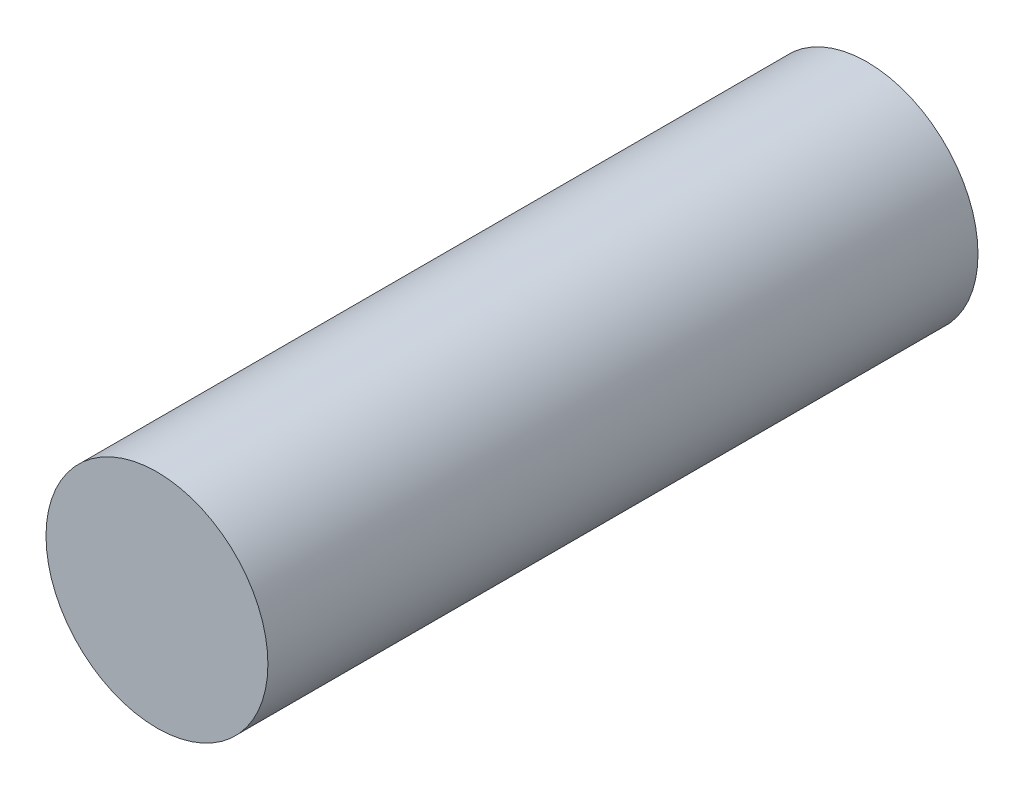
ISO-10303-21;
HEADER;
FILE_DESCRIPTION(('STEP AP214'),'2;1');
FILE_NAME('part.step','',(''),(''),'','','');
FILE_SCHEMA(('AUTOMOTIVE_DESIGN { 1 0 10303 214 1 1 1 1 }'));
ENDSEC;
DATA;
#1=APPLICATION_CONTEXT('core data for automotive mechanical design processes');
#2=APPLICATION_PROTOCOL_DEFINITION('international standard','automotive_design',2000,#1);
#3=PRODUCT_CONTEXT('',#1,'mechanical');
#4=PRODUCT('Part','Part','',(#3));
#5=PRODUCT_RELATED_PRODUCT_CATEGORY('part','',(#4));
#6=PRODUCT_DEFINITION_FORMATION('','',#4);
#7=PRODUCT_DEFINITION_CONTEXT('part definition',#1,'design');
#8=PRODUCT_DEFINITION('design','',#6,#7);
#9=PRODUCT_DEFINITION_SHAPE('','',#8);
#10=(LENGTH_UNIT() NAMED_UNIT(*) SI_UNIT(.MILLI.,.METRE.));
#11=(NAMED_UNIT(*) PLANE_ANGLE_UNIT() SI_UNIT($,.RADIAN.));
#12=(NAMED_UNIT(*) SI_UNIT($,.STERADIAN.) SOLID_ANGLE_UNIT());
#13=UNCERTAINTY_MEASURE_WITH_UNIT(LENGTH_MEASURE(1.E-05),#10,'distance_accuracy_value','');
#14=(GEOMETRIC_REPRESENTATION_CONTEXT(3) GLOBAL_UNCERTAINTY_ASSIGNED_CONTEXT((#13)) GLOBAL_UNIT_ASSIGNED_CONTEXT((#10,
#11,#12)) REPRESENTATION_CONTEXT('',''));
#15=CARTESIAN_POINT('',(0.,0.,0.));
#16=DIRECTION('',(0.,0.,1.));
#17=DIRECTION('',(1.,0.,0.));
#18=AXIS2_PLACEMENT_3D('',#15,#16,#17);
#19=CARTESIAN_POINT('',(6780.77584034497,3567.96813978666,10.16));
#20=DIRECTION('',(0.,0.,-1.));
#21=DIRECTION('',(-1.,0.,0.));
#22=AXIS2_PLACEMENT_3D('',#19,#20,#21);
#23=CYLINDRICAL_SURFACE('',#22,1.5875000000003);
#24=CARTESIAN_POINT('',(6780.77584034497,3567.96813978666,10.16));
#25=DIRECTION('',(0.,0.,1.));
#26=DIRECTION('',(1.,0.,0.));
#27=AXIS2_PLACEMENT_3D('',#24,#25,#26);
#28=CIRCLE('',#27,1.5875000000003);
#29=CARTESIAN_POINT('',(6782.36334034497,3567.96813978666,10.16));
#30=VERTEX_POINT('',#29);
#31=EDGE_CURVE('E10',#30,#30,#28,.T.);
#32=ORIENTED_EDGE('',*,*,#31,.F.);
#33=EDGE_LOOP('',(#32));
#34=FACE_BOUND('',#33,.T.);
#35=CARTESIAN_POINT('',(6780.77584034497,3567.96813978666,0.));
#36=DIRECTION('',(0.,0.,1.));
#37=DIRECTION('',(1.,0.,0.));
#38=AXIS2_PLACEMENT_3D('',#35,#36,#37);
#39=CIRCLE('',#38,1.5875000000003);
#40=CARTESIAN_POINT('',(6782.36334034497,3567.96813978666,0.));
#41=VERTEX_POINT('',#40);
#42=EDGE_CURVE('E34',#41,#41,#39,.T.);
#43=ORIENTED_EDGE('',*,*,#42,.T.);
#44=EDGE_LOOP('',(#43));
#45=FACE_BOUND('',#44,.T.);
#46=ADVANCED_FACE('F31',(#34,#45),#23,.T.);
#47=CARTESIAN_POINT('',(6780.77584034497,3567.96813978666,10.16));
#48=DIRECTION('',(0.,0.,1.));
#49=DIRECTION('',(1.,0.,0.));
#50=AXIS2_PLACEMENT_3D('',#47,#48,#49);
#51=PLANE('',#50);
#52=ORIENTED_EDGE('',*,*,#31,.T.);
#53=EDGE_LOOP('',(#52));
#54=FACE_BOUND('',#53,.T.);
#55=ADVANCED_FACE('F46',(#54),#51,.T.);
#56=CARTESIAN_POINT('',(6780.77584034497,3567.96813978666,0.));
#57=DIRECTION('',(0.,0.,1.));
#58=DIRECTION('',(1.,0.,0.));
#59=AXIS2_PLACEMENT_3D('',#56,#57,#58);
#60=PLANE('',#59);
#61=ORIENTED_EDGE('',*,*,#42,.F.);
#62=EDGE_LOOP('',(#61));
#63=FACE_BOUND('',#62,.T.);
#64=ADVANCED_FACE('F44',(#63),#60,.F.);
#65=CLOSED_SHELL('',(#46,#55,#64));
#66=MANIFOLD_SOLID_BREP('B2',#65);
#67=ADVANCED_BREP_SHAPE_REPRESENTATION('',(#18,#66),#14);
#68=SHAPE_DEFINITION_REPRESENTATION(#9,#67);
ENDSEC;
END-ISO-10303-21;
